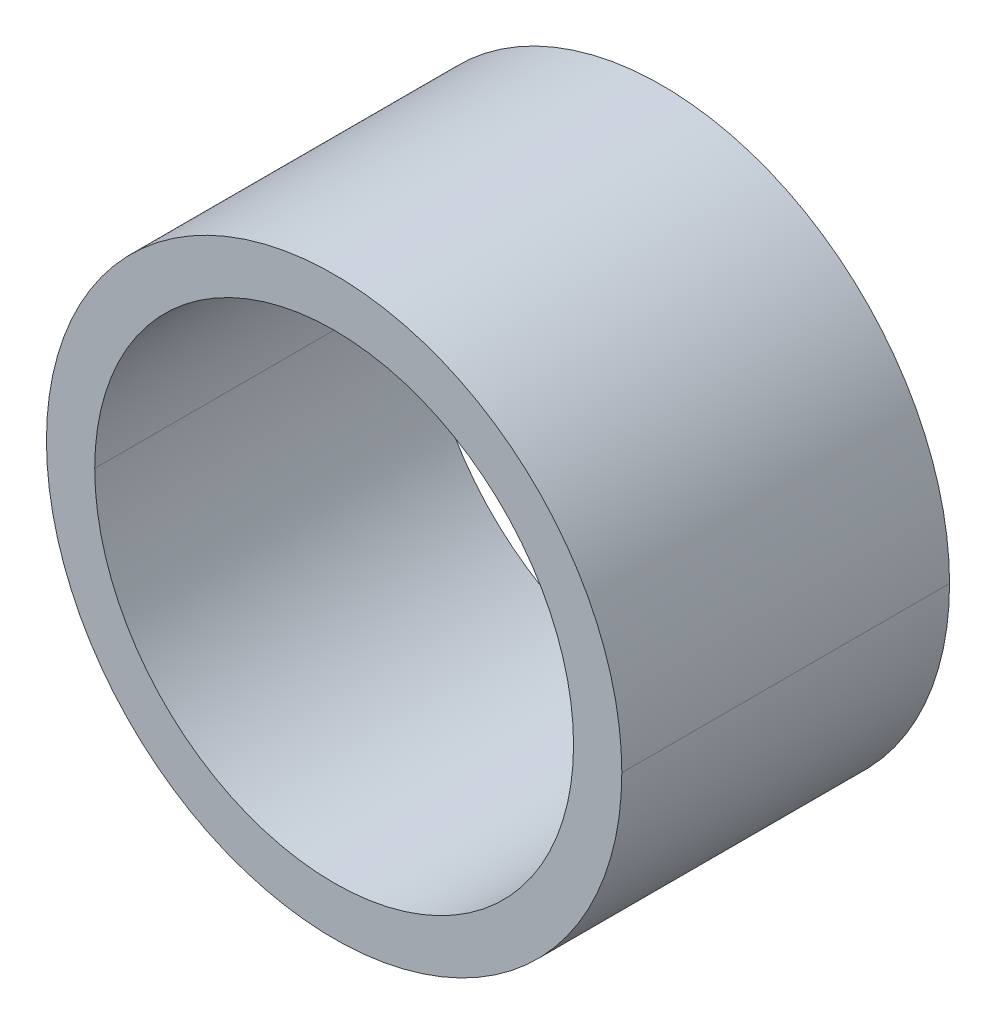
ISO-10303-21;
HEADER;
FILE_DESCRIPTION(('STEP AP214'),'2;1');
FILE_NAME('part.step','',(''),(''),'','','');
FILE_SCHEMA(('AUTOMOTIVE_DESIGN { 1 0 10303 214 1 1 1 1 }'));
ENDSEC;
DATA;
#1=APPLICATION_CONTEXT('core data for automotive mechanical design processes');
#2=APPLICATION_PROTOCOL_DEFINITION('international standard','automotive_design',2000,#1);
#3=PRODUCT_CONTEXT('',#1,'mechanical');
#4=PRODUCT('Part','Part','',(#3));
#5=PRODUCT_RELATED_PRODUCT_CATEGORY('part','',(#4));
#6=PRODUCT_DEFINITION_FORMATION('','',#4);
#7=PRODUCT_DEFINITION_CONTEXT('part definition',#1,'design');
#8=PRODUCT_DEFINITION('design','',#6,#7);
#9=PRODUCT_DEFINITION_SHAPE('','',#8);
#10=(LENGTH_UNIT() NAMED_UNIT(*) SI_UNIT(.MILLI.,.METRE.));
#11=(NAMED_UNIT(*) PLANE_ANGLE_UNIT() SI_UNIT($,.RADIAN.));
#12=(NAMED_UNIT(*) SI_UNIT($,.STERADIAN.) SOLID_ANGLE_UNIT());
#13=UNCERTAINTY_MEASURE_WITH_UNIT(LENGTH_MEASURE(1.E-05),#10,'distance_accuracy_value','');
#14=(GEOMETRIC_REPRESENTATION_CONTEXT(3) GLOBAL_UNCERTAINTY_ASSIGNED_CONTEXT((#13)) GLOBAL_UNIT_ASSIGNED_CONTEXT((#10,
#11,#12)) REPRESENTATION_CONTEXT('',''));
#15=CARTESIAN_POINT('',(0.,0.,0.));
#16=DIRECTION('',(0.,0.,1.));
#17=DIRECTION('',(1.,0.,0.));
#18=AXIS2_PLACEMENT_3D('',#15,#16,#17);
#19=CARTESIAN_POINT('',(3.28327224443434,-18.2755468007686,69.472055215506));
#20=DIRECTION('',(0.,0.,1.));
#21=DIRECTION('',(1.,0.,0.));
#22=AXIS2_PLACEMENT_3D('',#19,#20,#21);
#23=PLANE('',#22);
#24=CARTESIAN_POINT('',(3.28327224443434,-18.2755468007685,69.472055215506));
#25=DIRECTION('',(0.,0.,-1.));
#26=DIRECTION('',(1.,0.,0.));
#27=AXIS2_PLACEMENT_3D('',#24,#25,#26);
#28=CIRCLE('',#27,0.281258592131732);
#29=CARTESIAN_POINT('',(3.00201365230261,-18.2755468007685,69.472055215506));
#30=VERTEX_POINT('',#29);
#31=CARTESIAN_POINT('',(3.56453083656608,-18.2755468007685,69.472055215506));
#32=VERTEX_POINT('',#31);
#33=EDGE_CURVE('E11',#30,#32,#28,.T.);
#34=ORIENTED_EDGE('',*,*,#33,.F.);
#35=CARTESIAN_POINT('',(3.28327224443434,-18.2755468007685,69.472055215506));
#36=DIRECTION('',(0.,0.,-1.));
#37=DIRECTION('',(1.,0.,0.));
#38=AXIS2_PLACEMENT_3D('',#35,#36,#37);
#39=CIRCLE('',#38,0.281258592131732);
#40=EDGE_CURVE('E84',#32,#30,#39,.T.);
#41=ORIENTED_EDGE('',*,*,#40,.F.);
#42=EDGE_LOOP('',(#34,#41));
#43=FACE_BOUND('',#42,.T.);
#44=CARTESIAN_POINT('',(3.28327224443434,-18.2755468007686,69.472055215506));
#45=DIRECTION('',(0.,0.,1.));
#46=DIRECTION('',(1.,0.,0.));
#47=AXIS2_PLACEMENT_3D('',#44,#45,#46);
#48=CIRCLE('',#47,0.33796344257978);
#49=CARTESIAN_POINT('',(2.94530880185456,-18.2755468007686,69.472055215506));
#50=VERTEX_POINT('',#49);
#51=CARTESIAN_POINT('',(3.62123568701412,-18.2755468007686,69.472055215506));
#52=VERTEX_POINT('',#51);
#53=EDGE_CURVE('E36',#50,#52,#48,.T.);
#54=ORIENTED_EDGE('',*,*,#53,.F.);
#55=CARTESIAN_POINT('',(3.28327224443434,-18.2755468007686,69.472055215506));
#56=DIRECTION('',(0.,0.,1.));
#57=DIRECTION('',(1.,0.,0.));
#58=AXIS2_PLACEMENT_3D('',#55,#56,#57);
#59=CIRCLE('',#58,0.33796344257978);
#60=EDGE_CURVE('E107',#52,#50,#59,.T.);
#61=ORIENTED_EDGE('',*,*,#60,.F.);
#62=EDGE_LOOP('',(#54,#61));
#63=FACE_BOUND('',#62,.T.);
#64=ADVANCED_FACE('F17',(#43,#63),#23,.F.);
#65=CARTESIAN_POINT('',(3.28327224443434,-18.2755468007686,69.857055215506));
#66=DIRECTION('',(0.,0.,1.));
#67=DIRECTION('',(1.,0.,0.));
#68=AXIS2_PLACEMENT_3D('',#65,#66,#67);
#69=PLANE('',#68);
#70=CARTESIAN_POINT('',(3.28327224443434,-18.2755468007685,69.857055215506));
#71=DIRECTION('',(0.,0.,-1.));
#72=DIRECTION('',(0.,-1.,0.));
#73=AXIS2_PLACEMENT_3D('',#70,#71,#72);
#74=CIRCLE('',#73,0.281258592131732);
#75=CARTESIAN_POINT('',(3.00201365230261,-18.2755468007685,69.857055215506));
#76=VERTEX_POINT('',#75);
#77=CARTESIAN_POINT('',(3.56453083656608,-18.2755468007685,69.857055215506));
#78=VERTEX_POINT('',#77);
#79=EDGE_CURVE('E20',#76,#78,#74,.T.);
#80=ORIENTED_EDGE('',*,*,#79,.T.);
#81=CARTESIAN_POINT('',(3.28327224443434,-18.2755468007685,69.857055215506));
#82=DIRECTION('',(0.,0.,-1.));
#83=DIRECTION('',(0.,-1.,0.));
#84=AXIS2_PLACEMENT_3D('',#81,#82,#83);
#85=CIRCLE('',#84,0.281258592131732);
#86=EDGE_CURVE('E72',#78,#76,#85,.T.);
#87=ORIENTED_EDGE('',*,*,#86,.T.);
#88=EDGE_LOOP('',(#80,#87));
#89=FACE_BOUND('',#88,.T.);
#90=CARTESIAN_POINT('',(3.28327224443434,-18.2755468007686,69.857055215506));
#91=DIRECTION('',(0.,0.,1.));
#92=DIRECTION('',(0.,-1.,0.));
#93=AXIS2_PLACEMENT_3D('',#90,#91,#92);
#94=CIRCLE('',#93,0.337963442579779);
#95=CARTESIAN_POINT('',(2.94530880185456,-18.2755468007686,69.857055215506));
#96=VERTEX_POINT('',#95);
#97=CARTESIAN_POINT('',(3.62123568701412,-18.2755468007686,69.857055215506));
#98=VERTEX_POINT('',#97);
#99=EDGE_CURVE('E103',#96,#98,#94,.T.);
#100=ORIENTED_EDGE('',*,*,#99,.T.);
#101=CARTESIAN_POINT('',(3.28327224443434,-18.2755468007686,69.857055215506));
#102=DIRECTION('',(0.,0.,1.));
#103=DIRECTION('',(0.,-1.,0.));
#104=AXIS2_PLACEMENT_3D('',#101,#102,#103);
#105=CIRCLE('',#104,0.337963442579779);
#106=EDGE_CURVE('E96',#98,#96,#105,.T.);
#107=ORIENTED_EDGE('',*,*,#106,.T.);
#108=EDGE_LOOP('',(#100,#107));
#109=FACE_BOUND('',#108,.T.);
#110=ADVANCED_FACE('F69',(#89,#109),#69,.T.);
#111=CARTESIAN_POINT('',(3.28327224443434,-18.2755468007685,69.822055215506));
#112=DIRECTION('',(0.,0.,-1.));
#113=DIRECTION('',(-1.,0.,0.));
#114=AXIS2_PLACEMENT_3D('',#111,#112,#113);
#115=CYLINDRICAL_SURFACE('',#114,0.281258592131732);
#116=DIRECTION('',(0.,0.,-1.));
#117=VECTOR('',#116,1.);
#118=CARTESIAN_POINT('',(3.56453083656608,-18.2755468007685,69.822055215506));
#119=LINE('',#118,#117);
#120=EDGE_CURVE('E78',#78,#32,#119,.T.);
#121=ORIENTED_EDGE('',*,*,#120,.F.);
#122=ORIENTED_EDGE('',*,*,#79,.F.);
#123=DIRECTION('',(0.,0.,-1.));
#124=VECTOR('',#123,1.);
#125=CARTESIAN_POINT('',(3.00201365230261,-18.2755468007685,69.822055215506));
#126=LINE('',#125,#124);
#127=EDGE_CURVE('E87',#76,#30,#126,.T.);
#128=ORIENTED_EDGE('',*,*,#127,.T.);
#129=ORIENTED_EDGE('',*,*,#33,.T.);
#130=EDGE_LOOP('',(#121,#122,#128,#129));
#131=FACE_BOUND('',#130,.T.);
#132=ADVANCED_FACE('F79',(#131),#115,.F.);
#133=CARTESIAN_POINT('',(3.28327224443434,-18.2755468007686,69.822055215506));
#134=DIRECTION('',(0.,0.,-1.));
#135=DIRECTION('',(-1.,0.,0.));
#136=AXIS2_PLACEMENT_3D('',#133,#134,#135);
#137=CYLINDRICAL_SURFACE('',#136,0.33796344257978);
#138=DIRECTION('',(0.,0.,-1.));
#139=VECTOR('',#138,1.);
#140=CARTESIAN_POINT('',(3.62123568701412,-18.2755468007686,69.822055215506));
#141=LINE('',#140,#139);
#142=EDGE_CURVE('E100',#98,#52,#141,.T.);
#143=ORIENTED_EDGE('',*,*,#142,.F.);
#144=ORIENTED_EDGE('',*,*,#99,.F.);
#145=DIRECTION('',(0.,0.,-1.));
#146=VECTOR('',#145,1.);
#147=CARTESIAN_POINT('',(2.94530880185456,-18.2755468007686,69.822055215506));
#148=LINE('',#147,#146);
#149=EDGE_CURVE('E110',#96,#50,#148,.T.);
#150=ORIENTED_EDGE('',*,*,#149,.T.);
#151=ORIENTED_EDGE('',*,*,#53,.T.);
#152=EDGE_LOOP('',(#143,#144,#150,#151));
#153=FACE_BOUND('',#152,.T.);
#154=ADVANCED_FACE('F117',(#153),#137,.T.);
#155=CARTESIAN_POINT('',(3.28327224443434,-18.2755468007686,69.822055215506));
#156=DIRECTION('',(0.,0.,-1.));
#157=DIRECTION('',(-1.,0.,0.));
#158=AXIS2_PLACEMENT_3D('',#155,#156,#157);
#159=CYLINDRICAL_SURFACE('',#158,0.33796344257978);
#160=ORIENTED_EDGE('',*,*,#106,.F.);
#161=ORIENTED_EDGE('',*,*,#142,.T.);
#162=ORIENTED_EDGE('',*,*,#60,.T.);
#163=ORIENTED_EDGE('',*,*,#149,.F.);
#164=EDGE_LOOP('',(#160,#161,#162,#163));
#165=FACE_BOUND('',#164,.T.);
#166=ADVANCED_FACE('F119',(#165),#159,.T.);
#167=CARTESIAN_POINT('',(3.28327224443434,-18.2755468007685,69.822055215506));
#168=DIRECTION('',(0.,0.,-1.));
#169=DIRECTION('',(-1.,0.,0.));
#170=AXIS2_PLACEMENT_3D('',#167,#168,#169);
#171=CYLINDRICAL_SURFACE('',#170,0.281258592131732);
#172=ORIENTED_EDGE('',*,*,#86,.F.);
#173=ORIENTED_EDGE('',*,*,#120,.T.);
#174=ORIENTED_EDGE('',*,*,#40,.T.);
#175=ORIENTED_EDGE('',*,*,#127,.F.);
#176=EDGE_LOOP('',(#172,#173,#174,#175));
#177=FACE_BOUND('',#176,.T.);
#178=ADVANCED_FACE('F86',(#177),#171,.F.);
#179=CLOSED_SHELL('',(#64,#110,#132,#154,#166,#178));
#180=MANIFOLD_SOLID_BREP('B1',#179);
#181=ADVANCED_BREP_SHAPE_REPRESENTATION('',(#18,#180),#14);
#182=SHAPE_DEFINITION_REPRESENTATION(#9,#181);
ENDSEC;
END-ISO-10303-21;
